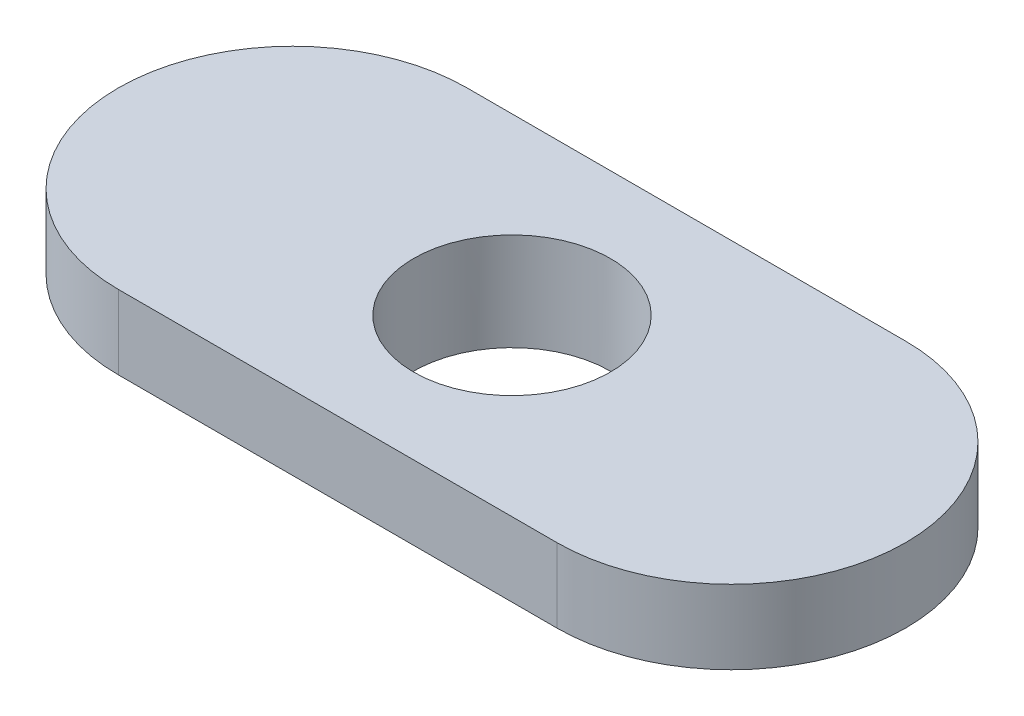
ISO-10303-21;
HEADER;
FILE_DESCRIPTION(('STEP AP214'),'2;1');
FILE_NAME('part.step','',(''),(''),'','','');
FILE_SCHEMA(('AUTOMOTIVE_DESIGN { 1 0 10303 214 1 1 1 1 }'));
ENDSEC;
DATA;
#1=APPLICATION_CONTEXT('core data for automotive mechanical design processes');
#2=APPLICATION_PROTOCOL_DEFINITION('international standard','automotive_design',2000,#1);
#3=PRODUCT_CONTEXT('',#1,'mechanical');
#4=PRODUCT('Part','Part','',(#3));
#5=PRODUCT_RELATED_PRODUCT_CATEGORY('part','',(#4));
#6=PRODUCT_DEFINITION_FORMATION('','',#4);
#7=PRODUCT_DEFINITION_CONTEXT('part definition',#1,'design');
#8=PRODUCT_DEFINITION('design','',#6,#7);
#9=PRODUCT_DEFINITION_SHAPE('','',#8);
#10=(LENGTH_UNIT() NAMED_UNIT(*) SI_UNIT(.MILLI.,.METRE.));
#11=(NAMED_UNIT(*) PLANE_ANGLE_UNIT() SI_UNIT($,.RADIAN.));
#12=(NAMED_UNIT(*) SI_UNIT($,.STERADIAN.) SOLID_ANGLE_UNIT());
#13=UNCERTAINTY_MEASURE_WITH_UNIT(LENGTH_MEASURE(1.E-05),#10,'distance_accuracy_value','');
#14=(GEOMETRIC_REPRESENTATION_CONTEXT(3) GLOBAL_UNCERTAINTY_ASSIGNED_CONTEXT((#13)) GLOBAL_UNIT_ASSIGNED_CONTEXT((#10,
#11,#12)) REPRESENTATION_CONTEXT('',''));
#15=CARTESIAN_POINT('',(0.,0.,0.));
#16=DIRECTION('',(0.,0.,1.));
#17=DIRECTION('',(1.,0.,0.));
#18=AXIS2_PLACEMENT_3D('',#15,#16,#17);
#19=CARTESIAN_POINT('',(-7.0739,-8.7376,0.));
#20=DIRECTION('',(0.,1.,0.));
#21=DIRECTION('',(0.,0.,1.));
#22=AXIS2_PLACEMENT_3D('',#19,#20,#21);
#23=PLANE('',#22);
#24=CARTESIAN_POINT('',(-7.0739,-8.7376,0.));
#25=DIRECTION('',(0.,1.,0.));
#26=DIRECTION('',(0.,0.,1.));
#27=AXIS2_PLACEMENT_3D('',#24,#25,#26);
#28=CIRCLE('',#27,5.6261);
#29=CARTESIAN_POINT('',(-7.0739,-8.7376,-5.6261));
#30=VERTEX_POINT('',#29);
#31=CARTESIAN_POINT('',(-7.0739,-8.7376,5.6261));
#32=VERTEX_POINT('',#31);
#33=EDGE_CURVE('E102',#30,#32,#28,.T.);
#34=ORIENTED_EDGE('',*,*,#33,.F.);
#35=DIRECTION('',(-1.,0.,0.));
#36=VECTOR('',#35,1.);
#37=CARTESIAN_POINT('',(-7.0739,-8.7376,-5.6261));
#38=LINE('',#37,#36);
#39=CARTESIAN_POINT('',(7.0739,-8.7376,-5.6261));
#40=VERTEX_POINT('',#39);
#41=EDGE_CURVE('E99',#40,#30,#38,.T.);
#42=ORIENTED_EDGE('',*,*,#41,.F.);
#43=CARTESIAN_POINT('',(7.0739,-8.7376,0.));
#44=DIRECTION('',(0.,1.,0.));
#45=DIRECTION('',(0.,0.,1.));
#46=AXIS2_PLACEMENT_3D('',#43,#44,#45);
#47=CIRCLE('',#46,5.6261);
#48=CARTESIAN_POINT('',(7.0739,-8.7376,5.6261));
#49=VERTEX_POINT('',#48);
#50=EDGE_CURVE('E91',#49,#40,#47,.T.);
#51=ORIENTED_EDGE('',*,*,#50,.F.);
#52=DIRECTION('',(1.,0.,0.));
#53=VECTOR('',#52,1.);
#54=CARTESIAN_POINT('',(-7.0739,-8.7376,5.6261));
#55=LINE('',#54,#53);
#56=EDGE_CURVE('E98',#32,#49,#55,.T.);
#57=ORIENTED_EDGE('',*,*,#56,.F.);
#58=EDGE_LOOP('',(#34,#42,#51,#57));
#59=FACE_BOUND('',#58,.T.);
#60=CARTESIAN_POINT('',(0.,-8.7376,0.));
#61=DIRECTION('',(0.,1.,0.));
#62=DIRECTION('',(0.,0.,1.));
#63=AXIS2_PLACEMENT_3D('',#60,#61,#62);
#64=CIRCLE('',#63,3.5687);
#65=CARTESIAN_POINT('',(0.,-8.7376,3.5687));
#66=VERTEX_POINT('',#65);
#67=EDGE_CURVE('E11',#66,#66,#64,.F.);
#68=ORIENTED_EDGE('',*,*,#67,.F.);
#69=EDGE_LOOP('',(#68));
#70=FACE_BOUND('',#69,.T.);
#71=ADVANCED_FACE('F41',(#59,#70),#23,.F.);
#72=CARTESIAN_POINT('',(-7.0739,-8.7376,0.));
#73=DIRECTION('',(0.,1.,0.));
#74=DIRECTION('',(0.,0.,1.));
#75=AXIS2_PLACEMENT_3D('',#72,#73,#74);
#76=CYLINDRICAL_SURFACE('',#75,5.6261);
#77=CARTESIAN_POINT('',(-7.0739,-6.35,0.));
#78=DIRECTION('',(0.,1.,0.));
#79=DIRECTION('',(0.,0.,1.));
#80=AXIS2_PLACEMENT_3D('',#77,#78,#79);
#81=CIRCLE('',#80,5.6261);
#82=CARTESIAN_POINT('',(-7.0739,-6.35,-5.6261));
#83=VERTEX_POINT('',#82);
#84=CARTESIAN_POINT('',(-7.0739,-6.35,5.6261));
#85=VERTEX_POINT('',#84);
#86=EDGE_CURVE('E109',#83,#85,#81,.T.);
#87=ORIENTED_EDGE('',*,*,#86,.F.);
#88=DIRECTION('',(0.,1.,0.));
#89=VECTOR('',#88,1.);
#90=CARTESIAN_POINT('',(-7.0739,-8.7376,-5.6261));
#91=LINE('',#90,#89);
#92=EDGE_CURVE('E50',#30,#83,#91,.T.);
#93=ORIENTED_EDGE('',*,*,#92,.F.);
#94=ORIENTED_EDGE('',*,*,#33,.T.);
#95=DIRECTION('',(0.,1.,0.));
#96=VECTOR('',#95,1.);
#97=CARTESIAN_POINT('',(-7.0739,-8.7376,5.6261));
#98=LINE('',#97,#96);
#99=EDGE_CURVE('E85',#32,#85,#98,.T.);
#100=ORIENTED_EDGE('',*,*,#99,.T.);
#101=EDGE_LOOP('',(#87,#93,#94,#100));
#102=FACE_BOUND('',#101,.T.);
#103=ADVANCED_FACE('F43',(#102),#76,.T.);
#104=CARTESIAN_POINT('',(-7.0739,-8.7376,-5.6261));
#105=DIRECTION('',(0.,0.,-1.));
#106=DIRECTION('',(-1.,0.,0.));
#107=AXIS2_PLACEMENT_3D('',#104,#105,#106);
#108=PLANE('',#107);
#109=DIRECTION('',(-1.,0.,0.));
#110=VECTOR('',#109,1.);
#111=CARTESIAN_POINT('',(-7.0739,-6.35,-5.6261));
#112=LINE('',#111,#110);
#113=CARTESIAN_POINT('',(7.0739,-6.35,-5.6261));
#114=VERTEX_POINT('',#113);
#115=EDGE_CURVE('E104',#114,#83,#112,.T.);
#116=ORIENTED_EDGE('',*,*,#115,.F.);
#117=DIRECTION('',(0.,1.,0.));
#118=VECTOR('',#117,1.);
#119=CARTESIAN_POINT('',(7.0739,-8.7376,-5.6261));
#120=LINE('',#119,#118);
#121=EDGE_CURVE('E74',#40,#114,#120,.T.);
#122=ORIENTED_EDGE('',*,*,#121,.F.);
#123=ORIENTED_EDGE('',*,*,#41,.T.);
#124=ORIENTED_EDGE('',*,*,#92,.T.);
#125=EDGE_LOOP('',(#116,#122,#123,#124));
#126=FACE_BOUND('',#125,.T.);
#127=ADVANCED_FACE('F121',(#126),#108,.T.);
#128=CARTESIAN_POINT('',(7.0739,-8.7376,0.));
#129=DIRECTION('',(0.,1.,0.));
#130=DIRECTION('',(0.,0.,1.));
#131=AXIS2_PLACEMENT_3D('',#128,#129,#130);
#132=CYLINDRICAL_SURFACE('',#131,5.6261);
#133=CARTESIAN_POINT('',(7.0739,-6.35,0.));
#134=DIRECTION('',(0.,1.,0.));
#135=DIRECTION('',(0.,0.,1.));
#136=AXIS2_PLACEMENT_3D('',#133,#134,#135);
#137=CIRCLE('',#136,5.6261);
#138=CARTESIAN_POINT('',(7.0739,-6.35,5.6261));
#139=VERTEX_POINT('',#138);
#140=EDGE_CURVE('E93',#139,#114,#137,.T.);
#141=ORIENTED_EDGE('',*,*,#140,.F.);
#142=DIRECTION('',(0.,1.,0.));
#143=VECTOR('',#142,1.);
#144=CARTESIAN_POINT('',(7.0739,-8.7376,5.6261));
#145=LINE('',#144,#143);
#146=EDGE_CURVE('E88',#49,#139,#145,.T.);
#147=ORIENTED_EDGE('',*,*,#146,.F.);
#148=ORIENTED_EDGE('',*,*,#50,.T.);
#149=ORIENTED_EDGE('',*,*,#121,.T.);
#150=EDGE_LOOP('',(#141,#147,#148,#149));
#151=FACE_BOUND('',#150,.T.);
#152=ADVANCED_FACE('F90',(#151),#132,.T.);
#153=CARTESIAN_POINT('',(-7.0739,-8.7376,5.6261));
#154=DIRECTION('',(0.,0.,1.));
#155=DIRECTION('',(1.,0.,0.));
#156=AXIS2_PLACEMENT_3D('',#153,#154,#155);
#157=PLANE('',#156);
#158=DIRECTION('',(1.,0.,0.));
#159=VECTOR('',#158,1.);
#160=CARTESIAN_POINT('',(-7.0739,-6.35,5.6261));
#161=LINE('',#160,#159);
#162=EDGE_CURVE('E112',#85,#139,#161,.T.);
#163=ORIENTED_EDGE('',*,*,#162,.F.);
#164=ORIENTED_EDGE('',*,*,#99,.F.);
#165=ORIENTED_EDGE('',*,*,#56,.T.);
#166=ORIENTED_EDGE('',*,*,#146,.T.);
#167=EDGE_LOOP('',(#163,#164,#165,#166));
#168=FACE_BOUND('',#167,.T.);
#169=ADVANCED_FACE('F101',(#168),#157,.T.);
#170=CARTESIAN_POINT('',(-7.0739,-6.35,0.));
#171=DIRECTION('',(0.,1.,0.));
#172=DIRECTION('',(0.,0.,1.));
#173=AXIS2_PLACEMENT_3D('',#170,#171,#172);
#174=PLANE('',#173);
#175=CARTESIAN_POINT('',(0.,-6.35,0.));
#176=DIRECTION('',(0.,1.,0.));
#177=DIRECTION('',(0.,0.,1.));
#178=AXIS2_PLACEMENT_3D('',#175,#176,#177);
#179=CIRCLE('',#178,3.175);
#180=CARTESIAN_POINT('',(0.,-6.35,3.175));
#181=VERTEX_POINT('',#180);
#182=EDGE_CURVE('E113',#181,#181,#179,.T.);
#183=ORIENTED_EDGE('',*,*,#182,.F.);
#184=EDGE_LOOP('',(#183));
#185=FACE_BOUND('',#184,.T.);
#186=ORIENTED_EDGE('',*,*,#86,.T.);
#187=ORIENTED_EDGE('',*,*,#162,.T.);
#188=ORIENTED_EDGE('',*,*,#140,.T.);
#189=ORIENTED_EDGE('',*,*,#115,.T.);
#190=EDGE_LOOP('',(#186,#187,#188,#189));
#191=FACE_BOUND('',#190,.T.);
#192=ADVANCED_FACE('F120',(#185,#191),#174,.T.);
#193=CARTESIAN_POINT('',(0.,-8.7376,0.));
#194=DIRECTION('',(0.,1.,0.));
#195=DIRECTION('',(0.,0.,1.));
#196=AXIS2_PLACEMENT_3D('',#193,#194,#195);
#197=CYLINDRICAL_SURFACE('',#196,3.175);
#198=ORIENTED_EDGE('',*,*,#182,.T.);
#199=EDGE_LOOP('',(#198));
#200=FACE_BOUND('',#199,.T.);
#201=CARTESIAN_POINT('',(0.,-9.4996,0.));
#202=DIRECTION('',(0.,-1.,0.));
#203=DIRECTION('',(0.,0.,-1.));
#204=AXIS2_PLACEMENT_3D('',#201,#202,#203);
#205=CIRCLE('',#204,3.175);
#206=CARTESIAN_POINT('',(0.,-9.4996,-3.175));
#207=VERTEX_POINT('',#206);
#208=EDGE_CURVE('E149',#207,#207,#205,.T.);
#209=ORIENTED_EDGE('',*,*,#208,.T.);
#210=EDGE_LOOP('',(#209));
#211=FACE_BOUND('',#210,.T.);
#212=ADVANCED_FACE('F137',(#200,#211),#197,.F.);
#213=CARTESIAN_POINT('',(0.,-9.4996,0.));
#214=DIRECTION('',(0.,-1.,0.));
#215=DIRECTION('',(0.,0.,-1.));
#216=AXIS2_PLACEMENT_3D('',#213,#214,#215);
#217=PLANE('',#216);
#218=CARTESIAN_POINT('',(0.,-9.4996,0.));
#219=DIRECTION('',(0.,-1.,0.));
#220=DIRECTION('',(0.,0.,-1.));
#221=AXIS2_PLACEMENT_3D('',#218,#219,#220);
#222=CIRCLE('',#221,3.5687);
#223=CARTESIAN_POINT('',(0.,-9.4996,3.5687));
#224=VERTEX_POINT('',#223);
#225=EDGE_CURVE('E147',#224,#224,#222,.T.);
#226=ORIENTED_EDGE('',*,*,#225,.T.);
#227=EDGE_LOOP('',(#226));
#228=FACE_BOUND('',#227,.T.);
#229=ORIENTED_EDGE('',*,*,#208,.F.);
#230=EDGE_LOOP('',(#229));
#231=FACE_BOUND('',#230,.T.);
#232=ADVANCED_FACE('F143',(#228,#231),#217,.T.);
#233=CARTESIAN_POINT('',(0.,-9.4996,0.));
#234=DIRECTION('',(0.,1.,0.));
#235=DIRECTION('',(0.,0.,1.));
#236=AXIS2_PLACEMENT_3D('',#233,#234,#235);
#237=CYLINDRICAL_SURFACE('',#236,3.5687);
#238=CARTESIAN_POINT('',(0.,-9.4996,3.5687));
#239=CARTESIAN_POINT('',(0.,-9.4916625,3.5687));
#240=CARTESIAN_POINT('',(0.,-9.483725,3.5687));
#241=CARTESIAN_POINT('',(0.,-9.46785,3.5687));
#242=CARTESIAN_POINT('',(0.,-9.4599125,3.5687));
#243=CARTESIAN_POINT('',(0.,-9.4440375,3.5687));
#244=CARTESIAN_POINT('',(0.,-9.4361,3.5687));
#245=CARTESIAN_POINT('',(0.,-9.420225,3.5687));
#246=CARTESIAN_POINT('',(0.,-9.4122875,3.5687));
#247=CARTESIAN_POINT('',(0.,-9.3964125,3.5687));
#248=CARTESIAN_POINT('',(0.,-9.388475,3.5687));
#249=CARTESIAN_POINT('',(0.,-9.3726,3.5687));
#250=CARTESIAN_POINT('',(0.,-9.3646625,3.5687));
#251=CARTESIAN_POINT('',(0.,-9.3487875,3.5687));
#252=CARTESIAN_POINT('',(0.,-9.34085,3.5687));
#253=CARTESIAN_POINT('',(0.,-9.324975,3.5687));
#254=CARTESIAN_POINT('',(0.,-9.3170375,3.5687));
#255=CARTESIAN_POINT('',(0.,-9.3011625,3.5687));
#256=CARTESIAN_POINT('',(0.,-9.293225,3.5687));
#257=CARTESIAN_POINT('',(0.,-9.27735,3.5687));
#258=CARTESIAN_POINT('',(0.,-9.2694125,3.5687));
#259=CARTESIAN_POINT('',(0.,-9.2535375,3.5687));
#260=CARTESIAN_POINT('',(0.,-9.2456,3.5687));
#261=CARTESIAN_POINT('',(0.,-9.229725,3.5687));
#262=CARTESIAN_POINT('',(0.,-9.2217875,3.5687));
#263=CARTESIAN_POINT('',(0.,-9.2059125,3.5687));
#264=CARTESIAN_POINT('',(0.,-9.197975,3.5687));
#265=CARTESIAN_POINT('',(0.,-9.1821,3.5687));
#266=CARTESIAN_POINT('',(0.,-9.1741625,3.5687));
#267=CARTESIAN_POINT('',(0.,-9.1582875,3.5687));
#268=CARTESIAN_POINT('',(0.,-9.15035,3.5687));
#269=CARTESIAN_POINT('',(0.,-9.134475,3.5687));
#270=CARTESIAN_POINT('',(0.,-9.1265375,3.5687));
#271=CARTESIAN_POINT('',(0.,-9.1106625,3.5687));
#272=CARTESIAN_POINT('',(0.,-9.102725,3.5687));
#273=CARTESIAN_POINT('',(0.,-9.08685,3.5687));
#274=CARTESIAN_POINT('',(0.,-9.0789125,3.5687));
#275=CARTESIAN_POINT('',(0.,-9.0630375,3.5687));
#276=CARTESIAN_POINT('',(0.,-9.0551,3.5687));
#277=CARTESIAN_POINT('',(0.,-9.039225,3.5687));
#278=CARTESIAN_POINT('',(0.,-9.0312875,3.5687));
#279=CARTESIAN_POINT('',(0.,-9.0154125,3.5687));
#280=CARTESIAN_POINT('',(0.,-9.007475,3.5687));
#281=CARTESIAN_POINT('',(0.,-8.9916,3.5687));
#282=CARTESIAN_POINT('',(0.,-8.9836625,3.5687));
#283=CARTESIAN_POINT('',(0.,-8.9677875,3.5687));
#284=CARTESIAN_POINT('',(0.,-8.95985,3.5687));
#285=CARTESIAN_POINT('',(0.,-8.943975,3.5687));
#286=CARTESIAN_POINT('',(0.,-8.9360375,3.5687));
#287=CARTESIAN_POINT('',(0.,-8.9201625,3.5687));
#288=CARTESIAN_POINT('',(0.,-8.912225,3.5687));
#289=CARTESIAN_POINT('',(0.,-8.89635,3.5687));
#290=CARTESIAN_POINT('',(0.,-8.8884125,3.5687));
#291=CARTESIAN_POINT('',(0.,-8.8725375,3.5687));
#292=CARTESIAN_POINT('',(0.,-8.8646,3.5687));
#293=CARTESIAN_POINT('',(0.,-8.848725,3.5687));
#294=CARTESIAN_POINT('',(0.,-8.8407875,3.5687));
#295=CARTESIAN_POINT('',(0.,-8.8249125,3.5687));
#296=CARTESIAN_POINT('',(0.,-8.816975,3.5687));
#297=CARTESIAN_POINT('',(0.,-8.8011,3.5687));
#298=CARTESIAN_POINT('',(0.,-8.7931625,3.5687));
#299=CARTESIAN_POINT('',(0.,-8.7772875,3.5687));
#300=CARTESIAN_POINT('',(0.,-8.76935,3.5687));
#301=CARTESIAN_POINT('',(0.,-8.753475,3.5687));
#302=CARTESIAN_POINT('',(0.,-8.7455375,3.5687));
#303=CARTESIAN_POINT('',(0.,-8.7376,3.5687));
#304=B_SPLINE_CURVE_WITH_KNOTS('',3,(#238,#239,#240,#241,#242,#243,#244,#245,#246,#247,#248,
#249,#250,#251,#252,#253,#254,#255,#256,#257,#258,#259,#260,#261,#262,#263,#264,#265,#266,#267,
#268,#269,#270,#271,#272,#273,#274,#275,#276,#277,#278,#279,#280,#281,#282,#283,#284,#285,#286,
#287,#288,#289,#290,#291,#292,#293,#294,#295,#296,#297,#298,#299,#300,#301,#302,#303),
.UNSPECIFIED.,.F.,.F.,(4,2,2,2,2,2,2,2,2,2,2,2,2,2,2,2,2,2,2,2,2,2,2,2,2,2,2,2,2,2,2,2,4),(0.,
0.0238125000000013,0.0476250000000008,0.0714375000000003,0.0952499999999998,0.119062500000001,
0.142875000000001,0.1666875,0.1905,0.214312500000001,0.238125,0.2619375,0.28575,
0.309562500000001,0.333375,0.3571875,0.380999999999999,0.404812500000001,0.428625,0.4524375,
0.476249999999999,0.500062500000001,0.523875,0.5476875,0.571499999999999,0.5953125,0.619125,
0.642937499999999,0.666749999999999,0.6905625,0.714375,0.738187499999999,0.761999999999999),.UNSPECIFIED.);
#305=EDGE_CURVE('BSEAM157',#224,#66,#304,.T.);
#306=ORIENTED_EDGE('',*,*,#225,.F.);
#307=ORIENTED_EDGE('',*,*,#67,.T.);
#308=ORIENTED_EDGE('',*,*,#305,.T.);
#309=ORIENTED_EDGE('',*,*,#305,.F.);
#310=EDGE_LOOP('',(#306,#308,#307,#309));
#311=FACE_BOUND('',#310,.T.);
#312=ADVANCED_FACE('F157',(#311),#237,.T.);
#313=CLOSED_SHELL('',(#71,#103,#127,#152,#169,#192,#212,#232,#312));
#314=MANIFOLD_SOLID_BREP('B2',#313);
#315=ADVANCED_BREP_SHAPE_REPRESENTATION('',(#18,#314),#14);
#316=SHAPE_DEFINITION_REPRESENTATION(#9,#315);
ENDSEC;
END-ISO-10303-21;
